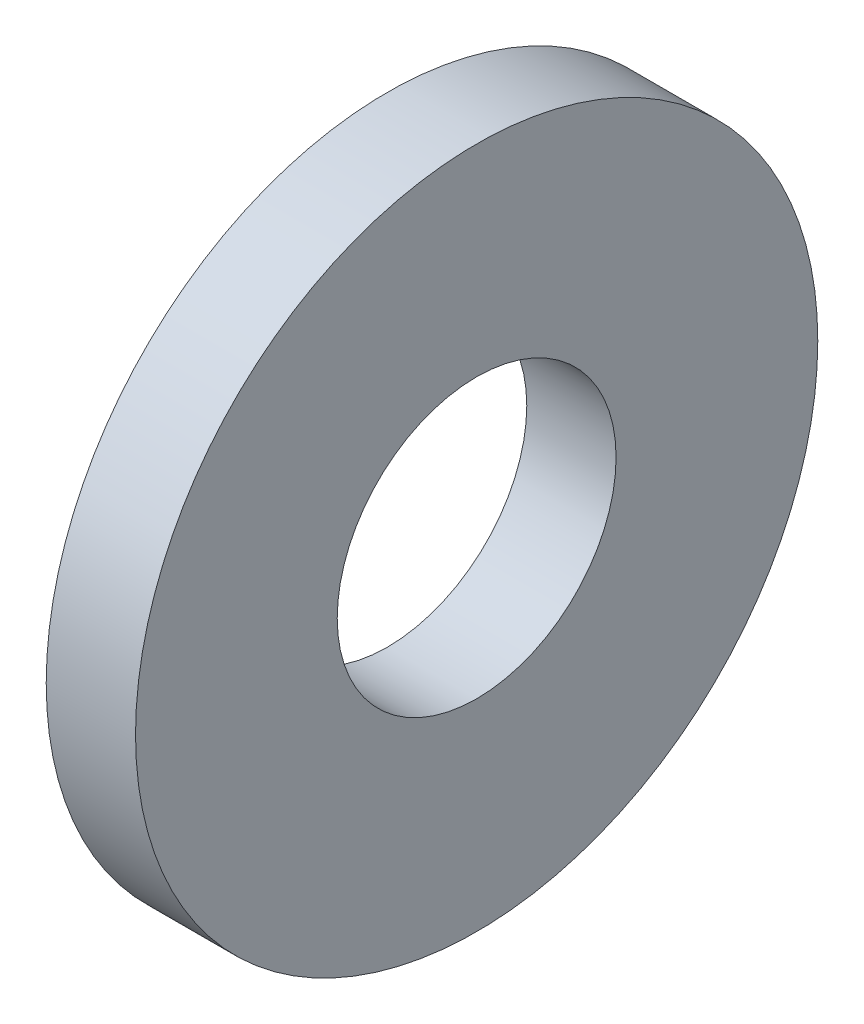
ISO-10303-21;
HEADER;
FILE_DESCRIPTION(('STEP AP214'),'2;1');
FILE_NAME('part.step','',(''),(''),'','','');
FILE_SCHEMA(('AUTOMOTIVE_DESIGN { 1 0 10303 214 1 1 1 1 }'));
ENDSEC;
DATA;
#1=APPLICATION_CONTEXT('core data for automotive mechanical design processes');
#2=APPLICATION_PROTOCOL_DEFINITION('international standard','automotive_design',2000,#1);
#3=PRODUCT_CONTEXT('',#1,'mechanical');
#4=PRODUCT('Part','Part','',(#3));
#5=PRODUCT_RELATED_PRODUCT_CATEGORY('part','',(#4));
#6=PRODUCT_DEFINITION_FORMATION('','',#4);
#7=PRODUCT_DEFINITION_CONTEXT('part definition',#1,'design');
#8=PRODUCT_DEFINITION('design','',#6,#7);
#9=PRODUCT_DEFINITION_SHAPE('','',#8);
#10=(LENGTH_UNIT() NAMED_UNIT(*) SI_UNIT(.MILLI.,.METRE.));
#11=(NAMED_UNIT(*) PLANE_ANGLE_UNIT() SI_UNIT($,.RADIAN.));
#12=(NAMED_UNIT(*) SI_UNIT($,.STERADIAN.) SOLID_ANGLE_UNIT());
#13=UNCERTAINTY_MEASURE_WITH_UNIT(LENGTH_MEASURE(1.E-05),#10,'distance_accuracy_value','');
#14=(GEOMETRIC_REPRESENTATION_CONTEXT(3) GLOBAL_UNCERTAINTY_ASSIGNED_CONTEXT((#13)) GLOBAL_UNIT_ASSIGNED_CONTEXT((#10,
#11,#12)) REPRESENTATION_CONTEXT('',''));
#15=CARTESIAN_POINT('',(0.,0.,0.));
#16=DIRECTION('',(0.,0.,1.));
#17=DIRECTION('',(1.,0.,0.));
#18=AXIS2_PLACEMENT_3D('',#15,#16,#17);
#19=CARTESIAN_POINT('',(2.286,0.,0.));
#20=DIRECTION('',(1.,0.,0.));
#21=DIRECTION('',(0.,0.,-1.));
#22=AXIS2_PLACEMENT_3D('',#19,#20,#21);
#23=PLANE('',#22);
#24=CARTESIAN_POINT('',(2.286,0.,0.));
#25=DIRECTION('',(1.,0.,0.));
#26=DIRECTION('',(0.,0.,-1.));
#27=AXIS2_PLACEMENT_3D('',#24,#25,#26);
#28=CIRCLE('',#27,8.73125);
#29=CARTESIAN_POINT('',(2.286,0.,-8.73125));
#30=VERTEX_POINT('',#29);
#31=EDGE_CURVE('E10',#30,#30,#28,.T.);
#32=ORIENTED_EDGE('',*,*,#31,.T.);
#33=EDGE_LOOP('',(#32));
#34=FACE_BOUND('',#33,.T.);
#35=CARTESIAN_POINT('',(2.286,0.,0.));
#36=DIRECTION('',(1.,0.,0.));
#37=DIRECTION('',(0.,0.,-1.));
#38=AXIS2_PLACEMENT_3D('',#35,#36,#37);
#39=CIRCLE('',#38,3.5687);
#40=CARTESIAN_POINT('',(2.286,0.,-3.5687));
#41=VERTEX_POINT('',#40);
#42=EDGE_CURVE('E41',#41,#41,#39,.T.);
#43=ORIENTED_EDGE('',*,*,#42,.F.);
#44=EDGE_LOOP('',(#43));
#45=FACE_BOUND('',#44,.T.);
#46=ADVANCED_FACE('F30',(#34,#45),#23,.T.);
#47=CARTESIAN_POINT('',(0.,0.,0.));
#48=DIRECTION('',(1.,0.,0.));
#49=DIRECTION('',(0.,0.,-1.));
#50=AXIS2_PLACEMENT_3D('',#47,#48,#49);
#51=PLANE('',#50);
#52=CARTESIAN_POINT('',(0.,0.,0.));
#53=DIRECTION('',(1.,0.,0.));
#54=DIRECTION('',(0.,0.,-1.));
#55=AXIS2_PLACEMENT_3D('',#52,#53,#54);
#56=CIRCLE('',#55,8.73125);
#57=CARTESIAN_POINT('',(0.,0.,-8.73125));
#58=VERTEX_POINT('',#57);
#59=EDGE_CURVE('E34',#58,#58,#56,.T.);
#60=ORIENTED_EDGE('',*,*,#59,.F.);
#61=EDGE_LOOP('',(#60));
#62=FACE_BOUND('',#61,.T.);
#63=CARTESIAN_POINT('',(0.,0.,0.));
#64=DIRECTION('',(1.,0.,0.));
#65=DIRECTION('',(0.,0.,-1.));
#66=AXIS2_PLACEMENT_3D('',#63,#64,#65);
#67=CIRCLE('',#66,3.5687);
#68=CARTESIAN_POINT('',(0.,0.,-3.5687));
#69=VERTEX_POINT('',#68);
#70=EDGE_CURVE('E43',#69,#69,#67,.T.);
#71=ORIENTED_EDGE('',*,*,#70,.T.);
#72=EDGE_LOOP('',(#71));
#73=FACE_BOUND('',#72,.T.);
#74=ADVANCED_FACE('F53',(#62,#73),#51,.F.);
#75=CARTESIAN_POINT('',(2.286,0.,0.));
#76=DIRECTION('',(-1.,0.,0.));
#77=DIRECTION('',(0.,0.,1.));
#78=AXIS2_PLACEMENT_3D('',#75,#76,#77);
#79=CYLINDRICAL_SURFACE('',#78,8.73125);
#80=ORIENTED_EDGE('',*,*,#31,.F.);
#81=EDGE_LOOP('',(#80));
#82=FACE_BOUND('',#81,.T.);
#83=ORIENTED_EDGE('',*,*,#59,.T.);
#84=EDGE_LOOP('',(#83));
#85=FACE_BOUND('',#84,.T.);
#86=ADVANCED_FACE('F32',(#82,#85),#79,.T.);
#87=CARTESIAN_POINT('',(2.286,0.,0.));
#88=DIRECTION('',(-1.,0.,0.));
#89=DIRECTION('',(0.,0.,1.));
#90=AXIS2_PLACEMENT_3D('',#87,#88,#89);
#91=CYLINDRICAL_SURFACE('',#90,3.5687);
#92=ORIENTED_EDGE('',*,*,#42,.T.);
#93=EDGE_LOOP('',(#92));
#94=FACE_BOUND('',#93,.T.);
#95=ORIENTED_EDGE('',*,*,#70,.F.);
#96=EDGE_LOOP('',(#95));
#97=FACE_BOUND('',#96,.T.);
#98=ADVANCED_FACE('F49',(#94,#97),#91,.F.);
#99=CLOSED_SHELL('',(#46,#74,#86,#98));
#100=MANIFOLD_SOLID_BREP('B2',#99);
#101=ADVANCED_BREP_SHAPE_REPRESENTATION('',(#18,#100),#14);
#102=SHAPE_DEFINITION_REPRESENTATION(#9,#101);
ENDSEC;
END-ISO-10303-21;
